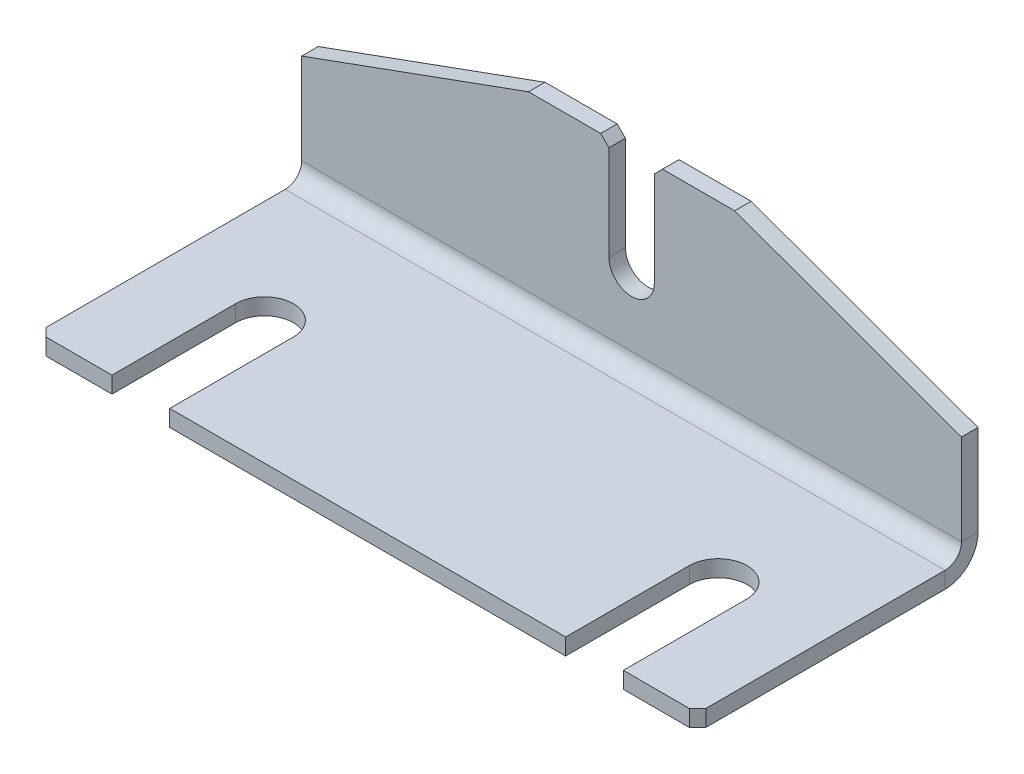
ISO-10303-21;
HEADER;
FILE_DESCRIPTION(('STEP AP214'),'2;1');
FILE_NAME('part.step','',(''),(''),'','','');
FILE_SCHEMA(('AUTOMOTIVE_DESIGN { 1 0 10303 214 1 1 1 1 }'));
ENDSEC;
DATA;
#1=APPLICATION_CONTEXT('core data for automotive mechanical design processes');
#2=APPLICATION_PROTOCOL_DEFINITION('international standard','automotive_design',2000,#1);
#3=PRODUCT_CONTEXT('',#1,'mechanical');
#4=PRODUCT('Part','Part','',(#3));
#5=PRODUCT_RELATED_PRODUCT_CATEGORY('part','',(#4));
#6=PRODUCT_DEFINITION_FORMATION('','',#4);
#7=PRODUCT_DEFINITION_CONTEXT('part definition',#1,'design');
#8=PRODUCT_DEFINITION('design','',#6,#7);
#9=PRODUCT_DEFINITION_SHAPE('','',#8);
#10=(LENGTH_UNIT() NAMED_UNIT(*) SI_UNIT(.MILLI.,.METRE.));
#11=(NAMED_UNIT(*) PLANE_ANGLE_UNIT() SI_UNIT($,.RADIAN.));
#12=(NAMED_UNIT(*) SI_UNIT($,.STERADIAN.) SOLID_ANGLE_UNIT());
#13=UNCERTAINTY_MEASURE_WITH_UNIT(LENGTH_MEASURE(1.E-05),#10,'distance_accuracy_value','');
#14=(GEOMETRIC_REPRESENTATION_CONTEXT(3) GLOBAL_UNCERTAINTY_ASSIGNED_CONTEXT((#13)) GLOBAL_UNIT_ASSIGNED_CONTEXT((#10,
#11,#12)) REPRESENTATION_CONTEXT('',''));
#15=CARTESIAN_POINT('',(0.,0.,0.));
#16=DIRECTION('',(0.,0.,1.));
#17=DIRECTION('',(1.,0.,0.));
#18=AXIS2_PLACEMENT_3D('',#15,#16,#17);
#19=CARTESIAN_POINT('',(0.,-4.,0.));
#20=DIRECTION('',(-1.,0.,0.));
#21=DIRECTION('',(0.,0.,1.));
#22=AXIS2_PLACEMENT_3D('',#19,#20,#21);
#23=PLANE('',#22);
#24=DIRECTION('',(0.,0.,1.));
#25=VECTOR('',#24,1.);
#26=CARTESIAN_POINT('',(0.,-4.,0.));
#27=LINE('',#26,#25);
#28=CARTESIAN_POINT('',(0.,-4.00000000000003,-60.));
#29=VERTEX_POINT('',#28);
#30=CARTESIAN_POINT('',(0.,-4.,-2.));
#31=VERTEX_POINT('',#30);
#32=EDGE_CURVE('E386',#29,#31,#27,.T.);
#33=ORIENTED_EDGE('',*,*,#32,.T.);
#34=DIRECTION('',(0.,1.,0.));
#35=VECTOR('',#34,1.);
#36=CARTESIAN_POINT('',(0.,-4.,-2.));
#37=LINE('',#36,#35);
#38=CARTESIAN_POINT('',(0.,0.,-2.));
#39=VERTEX_POINT('',#38);
#40=EDGE_CURVE('E456',#31,#39,#37,.T.);
#41=ORIENTED_EDGE('',*,*,#40,.T.);
#42=DIRECTION('',(0.,0.,1.));
#43=VECTOR('',#42,1.);
#44=CARTESIAN_POINT('',(0.,0.,0.));
#45=LINE('',#44,#43);
#46=CARTESIAN_POINT('',(0.,0.,-60.));
#47=VERTEX_POINT('',#46);
#48=EDGE_CURVE('E377',#47,#39,#45,.T.);
#49=ORIENTED_EDGE('',*,*,#48,.F.);
#50=DIRECTION('',(0.,1.,0.));
#51=VECTOR('',#50,1.);
#52=CARTESIAN_POINT('',(0.,-4.,-60.));
#53=LINE('',#52,#51);
#54=EDGE_CURVE('E453',#29,#47,#53,.T.);
#55=ORIENTED_EDGE('',*,*,#54,.F.);
#56=EDGE_LOOP('',(#33,#41,#49,#55));
#57=FACE_BOUND('',#56,.T.);
#58=ADVANCED_FACE('F105',(#57),#23,.T.);
#59=CARTESIAN_POINT('',(160.,-4.,0.));
#60=DIRECTION('',(1.,0.,0.));
#61=DIRECTION('',(0.,0.,-1.));
#62=AXIS2_PLACEMENT_3D('',#59,#60,#61);
#63=PLANE('',#62);
#64=DIRECTION('',(0.,0.,-1.));
#65=VECTOR('',#64,1.);
#66=CARTESIAN_POINT('',(160.,0.,0.));
#67=LINE('',#66,#65);
#68=CARTESIAN_POINT('',(160.,0.,-2.));
#69=VERTEX_POINT('',#68);
#70=CARTESIAN_POINT('',(160.,0.,-60.));
#71=VERTEX_POINT('',#70);
#72=EDGE_CURVE('E449',#69,#71,#67,.T.);
#73=ORIENTED_EDGE('',*,*,#72,.F.);
#74=DIRECTION('',(0.,-1.,0.));
#75=VECTOR('',#74,1.);
#76=CARTESIAN_POINT('',(160.,-4.,-2.));
#77=LINE('',#76,#75);
#78=CARTESIAN_POINT('',(160.,-4.,-2.));
#79=VERTEX_POINT('',#78);
#80=EDGE_CURVE('E13',#69,#79,#77,.T.);
#81=ORIENTED_EDGE('',*,*,#80,.T.);
#82=DIRECTION('',(0.,0.,-1.));
#83=VECTOR('',#82,1.);
#84=CARTESIAN_POINT('',(160.,-4.,0.));
#85=LINE('',#84,#83);
#86=CARTESIAN_POINT('',(160.,-4.,-60.));
#87=VERTEX_POINT('',#86);
#88=EDGE_CURVE('E415',#79,#87,#85,.T.);
#89=ORIENTED_EDGE('',*,*,#88,.T.);
#90=DIRECTION('',(0.,1.,0.));
#91=VECTOR('',#90,1.);
#92=CARTESIAN_POINT('',(160.,-4.,-60.));
#93=LINE('',#92,#91);
#94=EDGE_CURVE('E457',#87,#71,#93,.T.);
#95=ORIENTED_EDGE('',*,*,#94,.T.);
#96=EDGE_LOOP('',(#73,#81,#89,#95));
#97=FACE_BOUND('',#96,.T.);
#98=ADVANCED_FACE('F601',(#97),#63,.T.);
#99=CARTESIAN_POINT('',(142.,-4.,0.));
#100=DIRECTION('',(0.,0.,1.));
#101=DIRECTION('',(1.,0.,0.));
#102=AXIS2_PLACEMENT_3D('',#99,#100,#101);
#103=PLANE('',#102);
#104=DIRECTION('',(1.,0.,0.));
#105=VECTOR('',#104,1.);
#106=CARTESIAN_POINT('',(142.,-4.,0.));
#107=LINE('',#106,#105);
#108=CARTESIAN_POINT('',(142.,-4.,0.));
#109=VERTEX_POINT('',#108);
#110=CARTESIAN_POINT('',(158.,-4.,0.));
#111=VERTEX_POINT('',#110);
#112=EDGE_CURVE('E413',#109,#111,#107,.T.);
#113=ORIENTED_EDGE('',*,*,#112,.T.);
#114=DIRECTION('',(0.,1.,0.));
#115=VECTOR('',#114,1.);
#116=CARTESIAN_POINT('',(158.,-4.,0.));
#117=LINE('',#116,#115);
#118=CARTESIAN_POINT('',(158.,0.,0.));
#119=VERTEX_POINT('',#118);
#120=EDGE_CURVE('E114',#111,#119,#117,.T.);
#121=ORIENTED_EDGE('',*,*,#120,.T.);
#122=DIRECTION('',(1.,0.,0.));
#123=VECTOR('',#122,1.);
#124=CARTESIAN_POINT('',(142.,0.,0.));
#125=LINE('',#124,#123);
#126=CARTESIAN_POINT('',(142.,0.,0.));
#127=VERTEX_POINT('',#126);
#128=EDGE_CURVE('E446',#127,#119,#125,.T.);
#129=ORIENTED_EDGE('',*,*,#128,.F.);
#130=DIRECTION('',(0.,1.,0.));
#131=VECTOR('',#130,1.);
#132=CARTESIAN_POINT('',(142.,-4.,0.));
#133=LINE('',#132,#131);
#134=EDGE_CURVE('E460',#109,#127,#133,.T.);
#135=ORIENTED_EDGE('',*,*,#134,.F.);
#136=EDGE_LOOP('',(#113,#121,#129,#135));
#137=FACE_BOUND('',#136,.T.);
#138=ADVANCED_FACE('F490',(#137),#103,.T.);
#139=CARTESIAN_POINT('',(142.,-4.,-30.));
#140=DIRECTION('',(-1.,0.,0.));
#141=DIRECTION('',(0.,0.,1.));
#142=AXIS2_PLACEMENT_3D('',#139,#140,#141);
#143=PLANE('',#142);
#144=DIRECTION('',(0.,0.,1.));
#145=VECTOR('',#144,1.);
#146=CARTESIAN_POINT('',(142.,0.,-30.));
#147=LINE('',#146,#145);
#148=CARTESIAN_POINT('',(142.,0.,-30.));
#149=VERTEX_POINT('',#148);
#150=EDGE_CURVE('E443',#149,#127,#147,.T.);
#151=ORIENTED_EDGE('',*,*,#150,.F.);
#152=DIRECTION('',(0.,1.,0.));
#153=VECTOR('',#152,1.);
#154=CARTESIAN_POINT('',(142.,-4.,-30.));
#155=LINE('',#154,#153);
#156=CARTESIAN_POINT('',(142.,-4.,-30.));
#157=VERTEX_POINT('',#156);
#158=EDGE_CURVE('E462',#157,#149,#155,.T.);
#159=ORIENTED_EDGE('',*,*,#158,.F.);
#160=DIRECTION('',(0.,0.,1.));
#161=VECTOR('',#160,1.);
#162=CARTESIAN_POINT('',(142.,-4.,-30.));
#163=LINE('',#162,#161);
#164=EDGE_CURVE('E410',#157,#109,#163,.T.);
#165=ORIENTED_EDGE('',*,*,#164,.T.);
#166=ORIENTED_EDGE('',*,*,#134,.T.);
#167=EDGE_LOOP('',(#151,#159,#165,#166));
#168=FACE_BOUND('',#167,.T.);
#169=ADVANCED_FACE('F497',(#168),#143,.T.);
#170=CARTESIAN_POINT('',(135.,-4.,-30.));
#171=DIRECTION('',(0.,1.,0.));
#172=DIRECTION('',(0.,0.,1.));
#173=AXIS2_PLACEMENT_3D('',#170,#171,#172);
#174=CYLINDRICAL_SURFACE('',#173,7.00000000000003);
#175=CARTESIAN_POINT('',(135.,0.,-30.));
#176=DIRECTION('',(0.,-1.,0.));
#177=DIRECTION('',(0.,0.,1.));
#178=AXIS2_PLACEMENT_3D('',#175,#176,#177);
#179=CIRCLE('',#178,7.00000000000003);
#180=CARTESIAN_POINT('',(128.,0.,-30.0000000000001));
#181=VERTEX_POINT('',#180);
#182=EDGE_CURVE('E440',#181,#149,#179,.T.);
#183=ORIENTED_EDGE('',*,*,#182,.F.);
#184=DIRECTION('',(0.,1.,0.));
#185=VECTOR('',#184,1.);
#186=CARTESIAN_POINT('',(128.,-4.,-30.0000000000001));
#187=LINE('',#186,#185);
#188=CARTESIAN_POINT('',(128.,-4.,-30.0000000000001));
#189=VERTEX_POINT('',#188);
#190=EDGE_CURVE('E464',#189,#181,#187,.T.);
#191=ORIENTED_EDGE('',*,*,#190,.F.);
#192=CARTESIAN_POINT('',(135.,-4.,-30.));
#193=DIRECTION('',(0.,-1.,0.));
#194=DIRECTION('',(0.,0.,1.));
#195=AXIS2_PLACEMENT_3D('',#192,#193,#194);
#196=CIRCLE('',#195,7.00000000000003);
#197=EDGE_CURVE('E407',#189,#157,#196,.T.);
#198=ORIENTED_EDGE('',*,*,#197,.T.);
#199=ORIENTED_EDGE('',*,*,#158,.T.);
#200=EDGE_LOOP('',(#183,#191,#198,#199));
#201=FACE_BOUND('',#200,.T.);
#202=ADVANCED_FACE('F504',(#201),#174,.F.);
#203=CARTESIAN_POINT('',(128.,-4.,-30.0000000000001));
#204=DIRECTION('',(1.,0.,0.));
#205=DIRECTION('',(0.,0.,-1.));
#206=AXIS2_PLACEMENT_3D('',#203,#204,#205);
#207=PLANE('',#206);
#208=DIRECTION('',(0.,0.,-1.));
#209=VECTOR('',#208,1.);
#210=CARTESIAN_POINT('',(128.,0.,-30.0000000000001));
#211=LINE('',#210,#209);
#212=CARTESIAN_POINT('',(128.,0.,0.));
#213=VERTEX_POINT('',#212);
#214=EDGE_CURVE('E437',#213,#181,#211,.T.);
#215=ORIENTED_EDGE('',*,*,#214,.F.);
#216=DIRECTION('',(0.,1.,0.));
#217=VECTOR('',#216,1.);
#218=CARTESIAN_POINT('',(128.,-4.,0.));
#219=LINE('',#218,#217);
#220=CARTESIAN_POINT('',(128.,-4.,0.));
#221=VERTEX_POINT('',#220);
#222=EDGE_CURVE('E466',#221,#213,#219,.T.);
#223=ORIENTED_EDGE('',*,*,#222,.F.);
#224=DIRECTION('',(0.,0.,-1.));
#225=VECTOR('',#224,1.);
#226=CARTESIAN_POINT('',(128.,-4.,-30.0000000000001));
#227=LINE('',#226,#225);
#228=EDGE_CURVE('E404',#221,#189,#227,.T.);
#229=ORIENTED_EDGE('',*,*,#228,.T.);
#230=ORIENTED_EDGE('',*,*,#190,.T.);
#231=EDGE_LOOP('',(#215,#223,#229,#230));
#232=FACE_BOUND('',#231,.T.);
#233=ADVANCED_FACE('F507',(#232),#207,.T.);
#234=CARTESIAN_POINT('',(32.,-4.,0.));
#235=DIRECTION('',(0.,0.,1.));
#236=DIRECTION('',(1.,0.,0.));
#237=AXIS2_PLACEMENT_3D('',#234,#235,#236);
#238=PLANE('',#237);
#239=DIRECTION('',(1.,0.,0.));
#240=VECTOR('',#239,1.);
#241=CARTESIAN_POINT('',(32.,0.,0.));
#242=LINE('',#241,#240);
#243=CARTESIAN_POINT('',(32.,0.,0.));
#244=VERTEX_POINT('',#243);
#245=EDGE_CURVE('E434',#244,#213,#242,.T.);
#246=ORIENTED_EDGE('',*,*,#245,.F.);
#247=DIRECTION('',(0.,1.,0.));
#248=VECTOR('',#247,1.);
#249=CARTESIAN_POINT('',(32.,-4.,0.));
#250=LINE('',#249,#248);
#251=CARTESIAN_POINT('',(32.,-4.,0.));
#252=VERTEX_POINT('',#251);
#253=EDGE_CURVE('E468',#252,#244,#250,.T.);
#254=ORIENTED_EDGE('',*,*,#253,.F.);
#255=DIRECTION('',(1.,0.,0.));
#256=VECTOR('',#255,1.);
#257=CARTESIAN_POINT('',(32.,-4.,0.));
#258=LINE('',#257,#256);
#259=EDGE_CURVE('E401',#252,#221,#258,.T.);
#260=ORIENTED_EDGE('',*,*,#259,.T.);
#261=ORIENTED_EDGE('',*,*,#222,.T.);
#262=EDGE_LOOP('',(#246,#254,#260,#261));
#263=FACE_BOUND('',#262,.T.);
#264=ADVANCED_FACE('F512',(#263),#238,.T.);
#265=CARTESIAN_POINT('',(32.,-4.,-30.));
#266=DIRECTION('',(-1.,0.,0.));
#267=DIRECTION('',(0.,0.,1.));
#268=AXIS2_PLACEMENT_3D('',#265,#266,#267);
#269=PLANE('',#268);
#270=DIRECTION('',(0.,0.,1.));
#271=VECTOR('',#270,1.);
#272=CARTESIAN_POINT('',(32.,0.,-30.));
#273=LINE('',#272,#271);
#274=CARTESIAN_POINT('',(32.,0.,-30.));
#275=VERTEX_POINT('',#274);
#276=EDGE_CURVE('E431',#275,#244,#273,.T.);
#277=ORIENTED_EDGE('',*,*,#276,.F.);
#278=DIRECTION('',(0.,1.,0.));
#279=VECTOR('',#278,1.);
#280=CARTESIAN_POINT('',(32.,-4.,-30.));
#281=LINE('',#280,#279);
#282=CARTESIAN_POINT('',(32.,-4.,-30.));
#283=VERTEX_POINT('',#282);
#284=EDGE_CURVE('E470',#283,#275,#281,.T.);
#285=ORIENTED_EDGE('',*,*,#284,.F.);
#286=DIRECTION('',(0.,0.,1.));
#287=VECTOR('',#286,1.);
#288=CARTESIAN_POINT('',(32.,-4.,-30.));
#289=LINE('',#288,#287);
#290=EDGE_CURVE('E398',#283,#252,#289,.T.);
#291=ORIENTED_EDGE('',*,*,#290,.T.);
#292=ORIENTED_EDGE('',*,*,#253,.T.);
#293=EDGE_LOOP('',(#277,#285,#291,#292));
#294=FACE_BOUND('',#293,.T.);
#295=ADVANCED_FACE('F515',(#294),#269,.T.);
#296=CARTESIAN_POINT('',(25.,-4.,-30.));
#297=DIRECTION('',(0.,1.,0.));
#298=DIRECTION('',(0.,0.,1.));
#299=AXIS2_PLACEMENT_3D('',#296,#297,#298);
#300=CYLINDRICAL_SURFACE('',#299,7.00000000000002);
#301=CARTESIAN_POINT('',(25.,0.,-30.));
#302=DIRECTION('',(0.,-1.,0.));
#303=DIRECTION('',(0.,0.,-1.));
#304=AXIS2_PLACEMENT_3D('',#301,#302,#303);
#305=CIRCLE('',#304,7.00000000000002);
#306=CARTESIAN_POINT('',(18.,0.,-30.));
#307=VERTEX_POINT('',#306);
#308=EDGE_CURVE('E428',#307,#275,#305,.T.);
#309=ORIENTED_EDGE('',*,*,#308,.F.);
#310=DIRECTION('',(0.,1.,0.));
#311=VECTOR('',#310,1.);
#312=CARTESIAN_POINT('',(18.,-4.,-30.));
#313=LINE('',#312,#311);
#314=CARTESIAN_POINT('',(18.,-4.,-30.));
#315=VERTEX_POINT('',#314);
#316=EDGE_CURVE('E472',#315,#307,#313,.T.);
#317=ORIENTED_EDGE('',*,*,#316,.F.);
#318=CARTESIAN_POINT('',(25.,-4.,-30.));
#319=DIRECTION('',(0.,-1.,0.));
#320=DIRECTION('',(0.,0.,-1.));
#321=AXIS2_PLACEMENT_3D('',#318,#319,#320);
#322=CIRCLE('',#321,7.00000000000002);
#323=EDGE_CURVE('E395',#315,#283,#322,.T.);
#324=ORIENTED_EDGE('',*,*,#323,.T.);
#325=ORIENTED_EDGE('',*,*,#284,.T.);
#326=EDGE_LOOP('',(#309,#317,#324,#325));
#327=FACE_BOUND('',#326,.T.);
#328=ADVANCED_FACE('F520',(#327),#300,.F.);
#329=CARTESIAN_POINT('',(18.,-4.,-30.));
#330=DIRECTION('',(1.,0.,0.));
#331=DIRECTION('',(0.,0.,-1.));
#332=AXIS2_PLACEMENT_3D('',#329,#330,#331);
#333=PLANE('',#332);
#334=DIRECTION('',(0.,0.,-1.));
#335=VECTOR('',#334,1.);
#336=CARTESIAN_POINT('',(18.,0.,-30.));
#337=LINE('',#336,#335);
#338=CARTESIAN_POINT('',(18.,0.,0.));
#339=VERTEX_POINT('',#338);
#340=EDGE_CURVE('E425',#339,#307,#337,.T.);
#341=ORIENTED_EDGE('',*,*,#340,.F.);
#342=DIRECTION('',(0.,1.,0.));
#343=VECTOR('',#342,1.);
#344=CARTESIAN_POINT('',(18.,-4.,0.));
#345=LINE('',#344,#343);
#346=CARTESIAN_POINT('',(18.,-4.,0.));
#347=VERTEX_POINT('',#346);
#348=EDGE_CURVE('E420',#347,#339,#345,.T.);
#349=ORIENTED_EDGE('',*,*,#348,.F.);
#350=DIRECTION('',(0.,0.,-1.));
#351=VECTOR('',#350,1.);
#352=CARTESIAN_POINT('',(18.,-4.,-30.));
#353=LINE('',#352,#351);
#354=EDGE_CURVE('E392',#347,#315,#353,.T.);
#355=ORIENTED_EDGE('',*,*,#354,.T.);
#356=ORIENTED_EDGE('',*,*,#316,.T.);
#357=EDGE_LOOP('',(#341,#349,#355,#356));
#358=FACE_BOUND('',#357,.T.);
#359=ADVANCED_FACE('F523',(#358),#333,.T.);
#360=CARTESIAN_POINT('',(0.,-4.,0.));
#361=DIRECTION('',(0.,0.,1.));
#362=DIRECTION('',(1.,0.,0.));
#363=AXIS2_PLACEMENT_3D('',#360,#361,#362);
#364=PLANE('',#363);
#365=DIRECTION('',(1.,0.,0.));
#366=VECTOR('',#365,1.);
#367=CARTESIAN_POINT('',(0.,0.,0.));
#368=LINE('',#367,#366);
#369=CARTESIAN_POINT('',(2.,0.,0.));
#370=VERTEX_POINT('',#369);
#371=EDGE_CURVE('E423',#370,#339,#368,.T.);
#372=ORIENTED_EDGE('',*,*,#371,.F.);
#373=DIRECTION('',(0.,-1.,0.));
#374=VECTOR('',#373,1.);
#375=CARTESIAN_POINT('',(2.,-4.,0.));
#376=LINE('',#375,#374);
#377=CARTESIAN_POINT('',(2.,-4.,0.));
#378=VERTEX_POINT('',#377);
#379=EDGE_CURVE('E482',#370,#378,#376,.T.);
#380=ORIENTED_EDGE('',*,*,#379,.T.);
#381=DIRECTION('',(1.,0.,0.));
#382=VECTOR('',#381,1.);
#383=CARTESIAN_POINT('',(0.,-4.,0.));
#384=LINE('',#383,#382);
#385=EDGE_CURVE('E389',#378,#347,#384,.T.);
#386=ORIENTED_EDGE('',*,*,#385,.T.);
#387=ORIENTED_EDGE('',*,*,#348,.T.);
#388=EDGE_LOOP('',(#372,#380,#386,#387));
#389=FACE_BOUND('',#388,.T.);
#390=ADVANCED_FACE('F608',(#389),#364,.T.);
#391=CARTESIAN_POINT('',(135.,-4.,-30.));
#392=DIRECTION('',(0.,1.,0.));
#393=DIRECTION('',(0.,0.,1.));
#394=AXIS2_PLACEMENT_3D('',#391,#392,#393);
#395=PLANE('',#394);
#396=ORIENTED_EDGE('',*,*,#385,.F.);
#397=DIRECTION('',(0.707106781186548,0.,0.707106781186548));
#398=VECTOR('',#397,1.);
#399=CARTESIAN_POINT('',(0.,-4.,-2.));
#400=LINE('',#399,#398);
#401=EDGE_CURVE('E485',#378,#31,#400,.F.);
#402=ORIENTED_EDGE('',*,*,#401,.T.);
#403=ORIENTED_EDGE('',*,*,#32,.F.);
#404=DIRECTION('',(-1.,0.,0.));
#405=VECTOR('',#404,1.);
#406=CARTESIAN_POINT('',(0.,-4.,-60.));
#407=LINE('',#406,#405);
#408=EDGE_CURVE('E417',#87,#29,#407,.T.);
#409=ORIENTED_EDGE('',*,*,#408,.F.);
#410=ORIENTED_EDGE('',*,*,#88,.F.);
#411=DIRECTION('',(0.707106781186548,0.,-0.707106781186548));
#412=VECTOR('',#411,1.);
#413=CARTESIAN_POINT('',(158.,-4.,0.));
#414=LINE('',#413,#412);
#415=EDGE_CURVE('E121',#79,#111,#414,.F.);
#416=ORIENTED_EDGE('',*,*,#415,.T.);
#417=ORIENTED_EDGE('',*,*,#112,.F.);
#418=ORIENTED_EDGE('',*,*,#164,.F.);
#419=ORIENTED_EDGE('',*,*,#197,.F.);
#420=ORIENTED_EDGE('',*,*,#228,.F.);
#421=ORIENTED_EDGE('',*,*,#259,.F.);
#422=ORIENTED_EDGE('',*,*,#290,.F.);
#423=ORIENTED_EDGE('',*,*,#323,.F.);
#424=ORIENTED_EDGE('',*,*,#354,.F.);
#425=EDGE_LOOP('',(#396,#402,#403,#409,#410,#416,#417,#418,#419,#420,#421,#422,#423,#424));
#426=FACE_BOUND('',#425,.T.);
#427=ADVANCED_FACE('F500',(#426),#395,.F.);
#428=CARTESIAN_POINT('',(135.,0.,-30.));
#429=DIRECTION('',(0.,1.,0.));
#430=DIRECTION('',(0.,0.,1.));
#431=AXIS2_PLACEMENT_3D('',#428,#429,#430);
#432=PLANE('',#431);
#433=ORIENTED_EDGE('',*,*,#48,.T.);
#434=DIRECTION('',(-0.707106781186548,0.,-0.707106781186548));
#435=VECTOR('',#434,1.);
#436=CARTESIAN_POINT('',(53.5,0.,51.5));
#437=LINE('',#436,#435);
#438=EDGE_CURVE('E480',#39,#370,#437,.F.);
#439=ORIENTED_EDGE('',*,*,#438,.T.);
#440=ORIENTED_EDGE('',*,*,#371,.T.);
#441=ORIENTED_EDGE('',*,*,#340,.T.);
#442=ORIENTED_EDGE('',*,*,#308,.T.);
#443=ORIENTED_EDGE('',*,*,#276,.T.);
#444=ORIENTED_EDGE('',*,*,#245,.T.);
#445=ORIENTED_EDGE('',*,*,#214,.T.);
#446=ORIENTED_EDGE('',*,*,#182,.T.);
#447=ORIENTED_EDGE('',*,*,#150,.T.);
#448=ORIENTED_EDGE('',*,*,#128,.T.);
#449=DIRECTION('',(-0.707106781186548,0.,0.707106781186548));
#450=VECTOR('',#449,1.);
#451=CARTESIAN_POINT('',(161.5,0.,-3.50000000000002));
#452=LINE('',#451,#450);
#453=EDGE_CURVE('E478',#119,#69,#452,.F.);
#454=ORIENTED_EDGE('',*,*,#453,.T.);
#455=ORIENTED_EDGE('',*,*,#72,.T.);
#456=DIRECTION('',(-1.,0.,0.));
#457=VECTOR('',#456,1.);
#458=CARTESIAN_POINT('',(0.,0.,-60.));
#459=LINE('',#458,#457);
#460=EDGE_CURVE('E390',#71,#47,#459,.T.);
#461=ORIENTED_EDGE('',*,*,#460,.T.);
#462=EDGE_LOOP('',(#433,#439,#440,#441,#442,#443,#444,#445,#446,#447,#448,#454,#455,#461));
#463=FACE_BOUND('',#462,.T.);
#464=ADVANCED_FACE('F493',(#463),#432,.T.);
#465=CARTESIAN_POINT('',(160.,3.99999999999996,-60.));
#466=DIRECTION('',(1.,0.,0.));
#467=DIRECTION('',(0.,0.,-1.));
#468=AXIS2_PLACEMENT_3D('',#465,#466,#467);
#469=PLANE('',#468);
#470=DIRECTION('',(0.,0.,-1.));
#471=VECTOR('',#470,1.);
#472=CARTESIAN_POINT('',(160.,4.00000000000002,-68.0000000000001));
#473=LINE('',#472,#471);
#474=CARTESIAN_POINT('',(160.,3.99999999999996,-64.));
#475=VERTEX_POINT('',#474);
#476=CARTESIAN_POINT('',(160.,3.99999999999996,-68.));
#477=VERTEX_POINT('',#476);
#478=EDGE_CURVE('E371',#475,#477,#473,.T.);
#479=ORIENTED_EDGE('',*,*,#478,.F.);
#480=CARTESIAN_POINT('',(160.,3.99999999999996,-60.));
#481=DIRECTION('',(-1.,0.,0.));
#482=DIRECTION('',(0.,0.,1.));
#483=AXIS2_PLACEMENT_3D('',#480,#481,#482);
#484=CIRCLE('',#483,3.99999999999999);
#485=EDGE_CURVE('E381',#71,#475,#484,.F.);
#486=ORIENTED_EDGE('',*,*,#485,.F.);
#487=ORIENTED_EDGE('',*,*,#94,.F.);
#488=CARTESIAN_POINT('',(160.,3.99999999999996,-60.));
#489=DIRECTION('',(-1.,0.,0.));
#490=DIRECTION('',(0.,0.,1.));
#491=AXIS2_PLACEMENT_3D('',#488,#489,#490);
#492=CIRCLE('',#491,7.99999999999999);
#493=EDGE_CURVE('E374',#87,#477,#492,.F.);
#494=ORIENTED_EDGE('',*,*,#493,.T.);
#495=EDGE_LOOP('',(#479,#486,#487,#494));
#496=FACE_BOUND('',#495,.T.);
#497=ADVANCED_FACE('F633',(#496),#469,.T.);
#498=CARTESIAN_POINT('',(0.,3.99999999999996,-60.));
#499=DIRECTION('',(1.,0.,0.));
#500=DIRECTION('',(0.,0.,-1.));
#501=AXIS2_PLACEMENT_3D('',#498,#499,#500);
#502=PLANE('',#501);
#503=CARTESIAN_POINT('',(0.,3.99999999999996,-60.));
#504=DIRECTION('',(-1.,0.,0.));
#505=DIRECTION('',(0.,0.,1.));
#506=AXIS2_PLACEMENT_3D('',#503,#504,#505);
#507=CIRCLE('',#506,3.99999999999999);
#508=CARTESIAN_POINT('',(0.,3.99999999999996,-64.));
#509=VERTEX_POINT('',#508);
#510=EDGE_CURVE('E290',#509,#47,#507,.T.);
#511=ORIENTED_EDGE('',*,*,#510,.F.);
#512=DIRECTION('',(0.,0.,-1.));
#513=VECTOR('',#512,1.);
#514=CARTESIAN_POINT('',(0.,3.99999999999999,-64.));
#515=LINE('',#514,#513);
#516=CARTESIAN_POINT('',(0.,4.00000000000002,-68.));
#517=VERTEX_POINT('',#516);
#518=EDGE_CURVE('E366',#509,#517,#515,.T.);
#519=ORIENTED_EDGE('',*,*,#518,.T.);
#520=CARTESIAN_POINT('',(0.,3.99999999999996,-60.));
#521=DIRECTION('',(-1.,0.,0.));
#522=DIRECTION('',(0.,0.,1.));
#523=AXIS2_PLACEMENT_3D('',#520,#521,#522);
#524=CIRCLE('',#523,7.99999999999999);
#525=EDGE_CURVE('E378',#517,#29,#524,.T.);
#526=ORIENTED_EDGE('',*,*,#525,.T.);
#527=ORIENTED_EDGE('',*,*,#54,.T.);
#528=EDGE_LOOP('',(#511,#519,#526,#527));
#529=FACE_BOUND('',#528,.T.);
#530=ADVANCED_FACE('F539',(#529),#502,.F.);
#531=CARTESIAN_POINT('',(0.,3.99999999999996,-60.));
#532=DIRECTION('',(-1.,0.,0.));
#533=DIRECTION('',(0.,0.,-1.));
#534=AXIS2_PLACEMENT_3D('',#531,#532,#533);
#535=CYLINDRICAL_SURFACE('',#534,7.99999999999999);
#536=ORIENTED_EDGE('',*,*,#408,.T.);
#537=ORIENTED_EDGE('',*,*,#525,.F.);
#538=DIRECTION('',(-1.,0.,0.));
#539=VECTOR('',#538,1.);
#540=CARTESIAN_POINT('',(160.,4.00000000000002,-68.));
#541=LINE('',#540,#539);
#542=EDGE_CURVE('E304',#517,#477,#541,.F.);
#543=ORIENTED_EDGE('',*,*,#542,.T.);
#544=ORIENTED_EDGE('',*,*,#493,.F.);
#545=EDGE_LOOP('',(#536,#537,#543,#544));
#546=FACE_BOUND('',#545,.T.);
#547=ADVANCED_FACE('F627',(#546),#535,.T.);
#548=CARTESIAN_POINT('',(0.,3.99999999999996,-60.));
#549=DIRECTION('',(-1.,0.,0.));
#550=DIRECTION('',(0.,0.,-1.));
#551=AXIS2_PLACEMENT_3D('',#548,#549,#550);
#552=CYLINDRICAL_SURFACE('',#551,3.99999999999999);
#553=ORIENTED_EDGE('',*,*,#460,.F.);
#554=ORIENTED_EDGE('',*,*,#485,.T.);
#555=DIRECTION('',(-1.,0.,0.));
#556=VECTOR('',#555,1.);
#557=CARTESIAN_POINT('',(160.,3.99999999999999,-64.));
#558=LINE('',#557,#556);
#559=EDGE_CURVE('E369',#475,#509,#558,.T.);
#560=ORIENTED_EDGE('',*,*,#559,.T.);
#561=ORIENTED_EDGE('',*,*,#510,.T.);
#562=EDGE_LOOP('',(#553,#554,#560,#561));
#563=FACE_BOUND('',#562,.T.);
#564=ADVANCED_FACE('F540',(#563),#552,.F.);
#565=CARTESIAN_POINT('',(0.,0.,-68.));
#566=DIRECTION('',(-1.,0.,0.));
#567=DIRECTION('',(0.,0.,1.));
#568=AXIS2_PLACEMENT_3D('',#565,#566,#567);
#569=PLANE('',#568);
#570=DIRECTION('',(0.,1.,0.));
#571=VECTOR('',#570,1.);
#572=CARTESIAN_POINT('',(0.,0.,-68.));
#573=LINE('',#572,#571);
#574=CARTESIAN_POINT('',(0.,26.,-68.));
#575=VERTEX_POINT('',#574);
#576=EDGE_CURVE('E284',#575,#517,#573,.F.);
#577=ORIENTED_EDGE('',*,*,#576,.T.);
#578=ORIENTED_EDGE('',*,*,#518,.F.);
#579=DIRECTION('',(0.,-1.,0.));
#580=VECTOR('',#579,1.);
#581=CARTESIAN_POINT('',(0.,21.,-64.));
#582=LINE('',#581,#580);
#583=CARTESIAN_POINT('',(0.,26.,-64.));
#584=VERTEX_POINT('',#583);
#585=EDGE_CURVE('E286',#584,#509,#582,.T.);
#586=ORIENTED_EDGE('',*,*,#585,.F.);
#587=DIRECTION('',(0.,0.,1.));
#588=VECTOR('',#587,1.);
#589=CARTESIAN_POINT('',(0.,26.,-68.));
#590=LINE('',#589,#588);
#591=EDGE_CURVE('E279',#575,#584,#590,.T.);
#592=ORIENTED_EDGE('',*,*,#591,.F.);
#593=EDGE_LOOP('',(#577,#578,#586,#592));
#594=FACE_BOUND('',#593,.T.);
#595=ADVANCED_FACE('F281',(#594),#569,.T.);
#596=CARTESIAN_POINT('',(160.,26.,-68.));
#597=DIRECTION('',(1.,0.,0.));
#598=DIRECTION('',(0.,0.,-1.));
#599=AXIS2_PLACEMENT_3D('',#596,#597,#598);
#600=PLANE('',#599);
#601=DIRECTION('',(0.,1.,0.));
#602=VECTOR('',#601,1.);
#603=CARTESIAN_POINT('',(160.,21.,-64.));
#604=LINE('',#603,#602);
#605=CARTESIAN_POINT('',(160.,26.,-64.));
#606=VERTEX_POINT('',#605);
#607=EDGE_CURVE('E363',#475,#606,#604,.T.);
#608=ORIENTED_EDGE('',*,*,#607,.F.);
#609=ORIENTED_EDGE('',*,*,#478,.T.);
#610=DIRECTION('',(0.,-1.,0.));
#611=VECTOR('',#610,1.);
#612=CARTESIAN_POINT('',(160.,26.,-68.));
#613=LINE('',#612,#611);
#614=CARTESIAN_POINT('',(160.,26.,-68.));
#615=VERTEX_POINT('',#614);
#616=EDGE_CURVE('E334',#477,#615,#613,.F.);
#617=ORIENTED_EDGE('',*,*,#616,.T.);
#618=DIRECTION('',(0.,0.,1.));
#619=VECTOR('',#618,1.);
#620=CARTESIAN_POINT('',(160.,26.,-68.));
#621=LINE('',#620,#619);
#622=EDGE_CURVE('E305',#615,#606,#621,.T.);
#623=ORIENTED_EDGE('',*,*,#622,.T.);
#624=EDGE_LOOP('',(#608,#609,#617,#623));
#625=FACE_BOUND('',#624,.T.);
#626=ADVANCED_FACE('F546',(#625),#600,.T.);
#627=CARTESIAN_POINT('',(80.,21.,-68.));
#628=DIRECTION('',(0.,0.,1.));
#629=DIRECTION('',(1.,0.,0.));
#630=AXIS2_PLACEMENT_3D('',#627,#628,#629);
#631=PLANE('',#630);
#632=ORIENTED_EDGE('',*,*,#542,.F.);
#633=ORIENTED_EDGE('',*,*,#576,.F.);
#634=DIRECTION('',(0.939793423488437,0.341743063086704,0.));
#635=VECTOR('',#634,1.);
#636=CARTESIAN_POINT('',(0.,26.,-68.));
#637=LINE('',#636,#635);
#638=CARTESIAN_POINT('',(55.,46.,-68.));
#639=VERTEX_POINT('',#638);
#640=EDGE_CURVE('E294',#639,#575,#637,.F.);
#641=ORIENTED_EDGE('',*,*,#640,.F.);
#642=DIRECTION('',(1.,0.,0.));
#643=VECTOR('',#642,1.);
#644=CARTESIAN_POINT('',(55.,46.,-68.));
#645=LINE('',#644,#643);
#646=CARTESIAN_POINT('',(72.5,46.,-68.));
#647=VERTEX_POINT('',#646);
#648=EDGE_CURVE('E299',#647,#639,#645,.F.);
#649=ORIENTED_EDGE('',*,*,#648,.F.);
#650=DIRECTION('',(0.70710678118655,-0.707106781186545,0.));
#651=VECTOR('',#650,1.);
#652=CARTESIAN_POINT('',(72.5,46.,-68.));
#653=LINE('',#652,#651);
#654=CARTESIAN_POINT('',(74.5,44.,-68.));
#655=VERTEX_POINT('',#654);
#656=EDGE_CURVE('E313',#655,#647,#653,.F.);
#657=ORIENTED_EDGE('',*,*,#656,.F.);
#658=DIRECTION('',(0.,-1.,0.));
#659=VECTOR('',#658,1.);
#660=CARTESIAN_POINT('',(74.5,44.,-68.));
#661=LINE('',#660,#659);
#662=CARTESIAN_POINT('',(74.5,21.,-68.));
#663=VERTEX_POINT('',#662);
#664=EDGE_CURVE('E316',#663,#655,#661,.F.);
#665=ORIENTED_EDGE('',*,*,#664,.F.);
#666=CARTESIAN_POINT('',(80.,21.,-68.));
#667=DIRECTION('',(0.,0.,1.));
#668=DIRECTION('',(1.,0.,0.));
#669=AXIS2_PLACEMENT_3D('',#666,#667,#668);
#670=CIRCLE('',#669,5.49999999999999);
#671=CARTESIAN_POINT('',(85.5,21.,-68.));
#672=VERTEX_POINT('',#671);
#673=EDGE_CURVE('E319',#672,#663,#670,.F.);
#674=ORIENTED_EDGE('',*,*,#673,.F.);
#675=DIRECTION('',(0.,1.,0.));
#676=VECTOR('',#675,1.);
#677=CARTESIAN_POINT('',(85.5,21.,-68.));
#678=LINE('',#677,#676);
#679=CARTESIAN_POINT('',(85.5,44.,-68.));
#680=VERTEX_POINT('',#679);
#681=EDGE_CURVE('E322',#680,#672,#678,.F.);
#682=ORIENTED_EDGE('',*,*,#681,.F.);
#683=DIRECTION('',(0.707106781186545,0.70710678118655,0.));
#684=VECTOR('',#683,1.);
#685=CARTESIAN_POINT('',(85.5,44.,-68.));
#686=LINE('',#685,#684);
#687=CARTESIAN_POINT('',(87.5,46.,-68.));
#688=VERTEX_POINT('',#687);
#689=EDGE_CURVE('E325',#688,#680,#686,.F.);
#690=ORIENTED_EDGE('',*,*,#689,.F.);
#691=DIRECTION('',(1.,0.,0.));
#692=VECTOR('',#691,1.);
#693=CARTESIAN_POINT('',(87.5,46.,-68.));
#694=LINE('',#693,#692);
#695=CARTESIAN_POINT('',(105.,46.,-68.));
#696=VERTEX_POINT('',#695);
#697=EDGE_CURVE('E328',#696,#688,#694,.F.);
#698=ORIENTED_EDGE('',*,*,#697,.F.);
#699=DIRECTION('',(0.939793423488437,-0.341743063086704,0.));
#700=VECTOR('',#699,1.);
#701=CARTESIAN_POINT('',(160.,26.,-68.));
#702=LINE('',#701,#700);
#703=EDGE_CURVE('E331',#615,#696,#702,.F.);
#704=ORIENTED_EDGE('',*,*,#703,.F.);
#705=ORIENTED_EDGE('',*,*,#616,.F.);
#706=EDGE_LOOP('',(#632,#633,#641,#649,#657,#665,#674,#682,#690,#698,#704,#705));
#707=FACE_BOUND('',#706,.T.);
#708=ADVANCED_FACE('F302',(#707),#631,.F.);
#709=CARTESIAN_POINT('',(80.,21.,-64.));
#710=DIRECTION('',(0.,0.,1.));
#711=DIRECTION('',(1.,0.,0.));
#712=AXIS2_PLACEMENT_3D('',#709,#710,#711);
#713=PLANE('',#712);
#714=ORIENTED_EDGE('',*,*,#585,.T.);
#715=ORIENTED_EDGE('',*,*,#559,.F.);
#716=ORIENTED_EDGE('',*,*,#607,.T.);
#717=DIRECTION('',(-0.939793423488437,0.341743063086704,0.));
#718=VECTOR('',#717,1.);
#719=CARTESIAN_POINT('',(90.948905109489,51.1094890510949,-64.));
#720=LINE('',#719,#718);
#721=CARTESIAN_POINT('',(105.,46.,-64.));
#722=VERTEX_POINT('',#721);
#723=EDGE_CURVE('E360',#606,#722,#720,.T.);
#724=ORIENTED_EDGE('',*,*,#723,.T.);
#725=DIRECTION('',(-1.,0.,0.));
#726=VECTOR('',#725,1.);
#727=CARTESIAN_POINT('',(80.,46.,-64.));
#728=LINE('',#727,#726);
#729=CARTESIAN_POINT('',(87.5,46.,-64.));
#730=VERTEX_POINT('',#729);
#731=EDGE_CURVE('E357',#722,#730,#728,.T.);
#732=ORIENTED_EDGE('',*,*,#731,.T.);
#733=DIRECTION('',(-0.707106781186545,-0.70710678118655,0.));
#734=VECTOR('',#733,1.);
#735=CARTESIAN_POINT('',(71.25,29.7499999999999,-64.));
#736=LINE('',#735,#734);
#737=CARTESIAN_POINT('',(85.5,44.,-64.));
#738=VERTEX_POINT('',#737);
#739=EDGE_CURVE('E354',#730,#738,#736,.T.);
#740=ORIENTED_EDGE('',*,*,#739,.T.);
#741=DIRECTION('',(0.,-1.,0.));
#742=VECTOR('',#741,1.);
#743=CARTESIAN_POINT('',(85.5,21.,-64.));
#744=LINE('',#743,#742);
#745=CARTESIAN_POINT('',(85.5,21.,-64.));
#746=VERTEX_POINT('',#745);
#747=EDGE_CURVE('E351',#738,#746,#744,.T.);
#748=ORIENTED_EDGE('',*,*,#747,.T.);
#749=CARTESIAN_POINT('',(80.,21.,-64.));
#750=DIRECTION('',(0.,0.,1.));
#751=DIRECTION('',(1.,0.,0.));
#752=AXIS2_PLACEMENT_3D('',#749,#750,#751);
#753=CIRCLE('',#752,5.49999999999999);
#754=CARTESIAN_POINT('',(74.5,21.,-64.));
#755=VERTEX_POINT('',#754);
#756=EDGE_CURVE('E348',#746,#755,#753,.F.);
#757=ORIENTED_EDGE('',*,*,#756,.T.);
#758=DIRECTION('',(0.,1.,0.));
#759=VECTOR('',#758,1.);
#760=CARTESIAN_POINT('',(74.5,21.,-64.));
#761=LINE('',#760,#759);
#762=CARTESIAN_POINT('',(74.5,44.,-64.));
#763=VERTEX_POINT('',#762);
#764=EDGE_CURVE('E345',#755,#763,#761,.T.);
#765=ORIENTED_EDGE('',*,*,#764,.T.);
#766=DIRECTION('',(-0.70710678118655,0.707106781186545,0.));
#767=VECTOR('',#766,1.);
#768=CARTESIAN_POINT('',(88.75,29.7500000000001,-64.));
#769=LINE('',#768,#767);
#770=CARTESIAN_POINT('',(72.5,46.,-64.));
#771=VERTEX_POINT('',#770);
#772=EDGE_CURVE('E342',#763,#771,#769,.T.);
#773=ORIENTED_EDGE('',*,*,#772,.T.);
#774=DIRECTION('',(-1.,0.,0.));
#775=VECTOR('',#774,1.);
#776=CARTESIAN_POINT('',(80.,46.,-64.));
#777=LINE('',#776,#775);
#778=CARTESIAN_POINT('',(55.,46.,-64.));
#779=VERTEX_POINT('',#778);
#780=EDGE_CURVE('E339',#771,#779,#777,.T.);
#781=ORIENTED_EDGE('',*,*,#780,.T.);
#782=DIRECTION('',(-0.939793423488437,-0.341743063086704,0.));
#783=VECTOR('',#782,1.);
#784=CARTESIAN_POINT('',(69.051094890511,51.1094890510949,-64.));
#785=LINE('',#784,#783);
#786=EDGE_CURVE('E337',#779,#584,#785,.T.);
#787=ORIENTED_EDGE('',*,*,#786,.T.);
#788=EDGE_LOOP('',(#714,#715,#716,#724,#732,#740,#748,#757,#765,#773,#781,#787));
#789=FACE_BOUND('',#788,.T.);
#790=ADVANCED_FACE('F544',(#789),#713,.T.);
#791=CARTESIAN_POINT('',(0.,26.,-68.));
#792=DIRECTION('',(-0.341743063086704,0.939793423488437,0.));
#793=DIRECTION('',(-0.939793423488437,-0.341743063086704,0.));
#794=AXIS2_PLACEMENT_3D('',#791,#792,#793);
#795=PLANE('',#794);
#796=ORIENTED_EDGE('',*,*,#786,.F.);
#797=DIRECTION('',(0.,0.,1.));
#798=VECTOR('',#797,1.);
#799=CARTESIAN_POINT('',(55.,46.,-68.));
#800=LINE('',#799,#798);
#801=EDGE_CURVE('E291',#639,#779,#800,.T.);
#802=ORIENTED_EDGE('',*,*,#801,.F.);
#803=ORIENTED_EDGE('',*,*,#640,.T.);
#804=ORIENTED_EDGE('',*,*,#591,.T.);
#805=EDGE_LOOP('',(#796,#802,#803,#804));
#806=FACE_BOUND('',#805,.T.);
#807=ADVANCED_FACE('F295',(#806),#795,.T.);
#808=CARTESIAN_POINT('',(55.,46.,-68.));
#809=DIRECTION('',(0.,1.,0.));
#810=DIRECTION('',(0.,0.,1.));
#811=AXIS2_PLACEMENT_3D('',#808,#809,#810);
#812=PLANE('',#811);
#813=ORIENTED_EDGE('',*,*,#780,.F.);
#814=DIRECTION('',(0.,0.,1.));
#815=VECTOR('',#814,1.);
#816=CARTESIAN_POINT('',(72.5,46.,-68.));
#817=LINE('',#816,#815);
#818=EDGE_CURVE('E583',#647,#771,#817,.T.);
#819=ORIENTED_EDGE('',*,*,#818,.F.);
#820=ORIENTED_EDGE('',*,*,#648,.T.);
#821=ORIENTED_EDGE('',*,*,#801,.T.);
#822=EDGE_LOOP('',(#813,#819,#820,#821));
#823=FACE_BOUND('',#822,.T.);
#824=ADVANCED_FACE('F588',(#823),#812,.T.);
#825=CARTESIAN_POINT('',(72.5,46.,-68.));
#826=DIRECTION('',(0.707106781186545,0.70710678118655,0.));
#827=DIRECTION('',(-0.70710678118655,0.707106781186545,0.));
#828=AXIS2_PLACEMENT_3D('',#825,#826,#827);
#829=PLANE('',#828);
#830=ORIENTED_EDGE('',*,*,#772,.F.);
#831=DIRECTION('',(0.,0.,1.));
#832=VECTOR('',#831,1.);
#833=CARTESIAN_POINT('',(74.5,44.,-68.));
#834=LINE('',#833,#832);
#835=EDGE_CURVE('E577',#655,#763,#834,.T.);
#836=ORIENTED_EDGE('',*,*,#835,.F.);
#837=ORIENTED_EDGE('',*,*,#656,.T.);
#838=ORIENTED_EDGE('',*,*,#818,.T.);
#839=EDGE_LOOP('',(#830,#836,#837,#838));
#840=FACE_BOUND('',#839,.T.);
#841=ADVANCED_FACE('F585',(#840),#829,.T.);
#842=CARTESIAN_POINT('',(74.5,44.,-68.));
#843=DIRECTION('',(1.,0.,0.));
#844=DIRECTION('',(0.,0.,-1.));
#845=AXIS2_PLACEMENT_3D('',#842,#843,#844);
#846=PLANE('',#845);
#847=ORIENTED_EDGE('',*,*,#764,.F.);
#848=DIRECTION('',(0.,0.,1.));
#849=VECTOR('',#848,1.);
#850=CARTESIAN_POINT('',(74.5,21.,-68.));
#851=LINE('',#850,#849);
#852=EDGE_CURVE('E574',#663,#755,#851,.T.);
#853=ORIENTED_EDGE('',*,*,#852,.F.);
#854=ORIENTED_EDGE('',*,*,#664,.T.);
#855=ORIENTED_EDGE('',*,*,#835,.T.);
#856=EDGE_LOOP('',(#847,#853,#854,#855));
#857=FACE_BOUND('',#856,.T.);
#858=ADVANCED_FACE('F579',(#857),#846,.T.);
#859=CARTESIAN_POINT('',(80.,21.,-68.));
#860=DIRECTION('',(0.,0.,1.));
#861=DIRECTION('',(1.,0.,0.));
#862=AXIS2_PLACEMENT_3D('',#859,#860,#861);
#863=CYLINDRICAL_SURFACE('',#862,5.49999999999999);
#864=ORIENTED_EDGE('',*,*,#756,.F.);
#865=DIRECTION('',(0.,0.,1.));
#866=VECTOR('',#865,1.);
#867=CARTESIAN_POINT('',(85.5,21.,-68.));
#868=LINE('',#867,#866);
#869=EDGE_CURVE('E566',#672,#746,#868,.T.);
#870=ORIENTED_EDGE('',*,*,#869,.F.);
#871=ORIENTED_EDGE('',*,*,#673,.T.);
#872=ORIENTED_EDGE('',*,*,#852,.T.);
#873=EDGE_LOOP('',(#864,#870,#871,#872));
#874=FACE_BOUND('',#873,.T.);
#875=ADVANCED_FACE('F572',(#874),#863,.F.);
#876=CARTESIAN_POINT('',(85.5,21.,-68.));
#877=DIRECTION('',(-1.,0.,0.));
#878=DIRECTION('',(0.,0.,1.));
#879=AXIS2_PLACEMENT_3D('',#876,#877,#878);
#880=PLANE('',#879);
#881=ORIENTED_EDGE('',*,*,#747,.F.);
#882=DIRECTION('',(0.,0.,1.));
#883=VECTOR('',#882,1.);
#884=CARTESIAN_POINT('',(85.5,44.,-68.));
#885=LINE('',#884,#883);
#886=EDGE_CURVE('E560',#680,#738,#885,.T.);
#887=ORIENTED_EDGE('',*,*,#886,.F.);
#888=ORIENTED_EDGE('',*,*,#681,.T.);
#889=ORIENTED_EDGE('',*,*,#869,.T.);
#890=EDGE_LOOP('',(#881,#887,#888,#889));
#891=FACE_BOUND('',#890,.T.);
#892=ADVANCED_FACE('F568',(#891),#880,.T.);
#893=CARTESIAN_POINT('',(85.5,44.,-68.));
#894=DIRECTION('',(-0.70710678118655,0.707106781186545,0.));
#895=DIRECTION('',(-0.707106781186545,-0.70710678118655,0.));
#896=AXIS2_PLACEMENT_3D('',#893,#894,#895);
#897=PLANE('',#896);
#898=ORIENTED_EDGE('',*,*,#739,.F.);
#899=DIRECTION('',(0.,0.,1.));
#900=VECTOR('',#899,1.);
#901=CARTESIAN_POINT('',(87.5,46.,-68.));
#902=LINE('',#901,#900);
#903=EDGE_CURVE('E557',#688,#730,#902,.T.);
#904=ORIENTED_EDGE('',*,*,#903,.F.);
#905=ORIENTED_EDGE('',*,*,#689,.T.);
#906=ORIENTED_EDGE('',*,*,#886,.T.);
#907=EDGE_LOOP('',(#898,#904,#905,#906));
#908=FACE_BOUND('',#907,.T.);
#909=ADVANCED_FACE('F562',(#908),#897,.T.);
#910=CARTESIAN_POINT('',(87.5,46.,-68.));
#911=DIRECTION('',(0.,1.,0.));
#912=DIRECTION('',(0.,0.,1.));
#913=AXIS2_PLACEMENT_3D('',#910,#911,#912);
#914=PLANE('',#913);
#915=ORIENTED_EDGE('',*,*,#731,.F.);
#916=DIRECTION('',(0.,0.,1.));
#917=VECTOR('',#916,1.);
#918=CARTESIAN_POINT('',(105.,46.,-68.));
#919=LINE('',#918,#917);
#920=EDGE_CURVE('E308',#696,#722,#919,.T.);
#921=ORIENTED_EDGE('',*,*,#920,.F.);
#922=ORIENTED_EDGE('',*,*,#697,.T.);
#923=ORIENTED_EDGE('',*,*,#903,.T.);
#924=EDGE_LOOP('',(#915,#921,#922,#923));
#925=FACE_BOUND('',#924,.T.);
#926=ADVANCED_FACE('F555',(#925),#914,.T.);
#927=CARTESIAN_POINT('',(160.,26.,-68.));
#928=DIRECTION('',(0.341743063086704,0.939793423488437,0.));
#929=DIRECTION('',(-0.939793423488437,0.341743063086704,0.));
#930=AXIS2_PLACEMENT_3D('',#927,#928,#929);
#931=PLANE('',#930);
#932=ORIENTED_EDGE('',*,*,#723,.F.);
#933=ORIENTED_EDGE('',*,*,#622,.F.);
#934=ORIENTED_EDGE('',*,*,#703,.T.);
#935=ORIENTED_EDGE('',*,*,#920,.T.);
#936=EDGE_LOOP('',(#932,#933,#934,#935));
#937=FACE_BOUND('',#936,.T.);
#938=ADVANCED_FACE('F551',(#937),#931,.T.);
#939=CARTESIAN_POINT('',(0.,-4.,-2.));
#940=DIRECTION('',(0.707106781186547,0.,-0.707106781186547));
#941=DIRECTION('',(0.,1.,0.));
#942=AXIS2_PLACEMENT_3D('',#939,#940,#941);
#943=PLANE('',#942);
#944=ORIENTED_EDGE('',*,*,#401,.F.);
#945=ORIENTED_EDGE('',*,*,#379,.F.);
#946=ORIENTED_EDGE('',*,*,#438,.F.);
#947=ORIENTED_EDGE('',*,*,#40,.F.);
#948=EDGE_LOOP('',(#944,#945,#946,#947));
#949=FACE_BOUND('',#948,.T.);
#950=ADVANCED_FACE('F530',(#949),#943,.F.);
#951=CARTESIAN_POINT('',(158.,-4.,0.));
#952=DIRECTION('',(-0.707106781186547,0.,-0.707106781186547));
#953=DIRECTION('',(0.,1.,0.));
#954=AXIS2_PLACEMENT_3D('',#951,#952,#953);
#955=PLANE('',#954);
#956=ORIENTED_EDGE('',*,*,#415,.F.);
#957=ORIENTED_EDGE('',*,*,#80,.F.);
#958=ORIENTED_EDGE('',*,*,#453,.F.);
#959=ORIENTED_EDGE('',*,*,#120,.F.);
#960=EDGE_LOOP('',(#956,#957,#958,#959));
#961=FACE_BOUND('',#960,.T.);
#962=ADVANCED_FACE('F108',(#961),#955,.F.);
#963=CLOSED_SHELL('',(#58,#98,#138,#169,#202,#233,#264,#295,#328,#359,#390,#427,#464,#497,#530,
#547,#564,#595,#626,#708,#790,#807,#824,#841,#858,#875,#892,#909,#926,#938,#950,#962));
#964=MANIFOLD_SOLID_BREP('B2',#963);
#965=ADVANCED_BREP_SHAPE_REPRESENTATION('',(#18,#964),#14);
#966=SHAPE_DEFINITION_REPRESENTATION(#9,#965);
ENDSEC;
END-ISO-10303-21;
